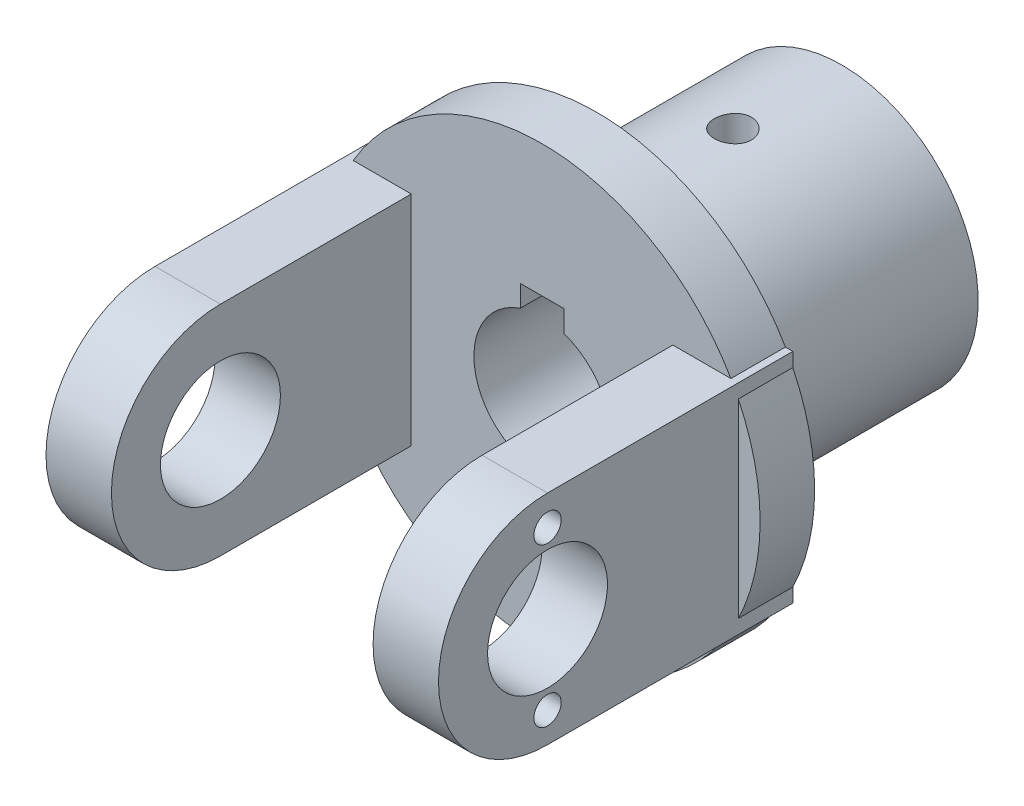
ISO-10303-21;
HEADER;
FILE_DESCRIPTION(('STEP AP214'),'2;1');
FILE_NAME('part.step','',(''),(''),'','','');
FILE_SCHEMA(('AUTOMOTIVE_DESIGN { 1 0 10303 214 1 1 1 1 }'));
ENDSEC;
DATA;
#1=APPLICATION_CONTEXT('core data for automotive mechanical design processes');
#2=APPLICATION_PROTOCOL_DEFINITION('international standard','automotive_design',2000,#1);
#3=PRODUCT_CONTEXT('',#1,'mechanical');
#4=PRODUCT('Part','Part','',(#3));
#5=PRODUCT_RELATED_PRODUCT_CATEGORY('part','',(#4));
#6=PRODUCT_DEFINITION_FORMATION('','',#4);
#7=PRODUCT_DEFINITION_CONTEXT('part definition',#1,'design');
#8=PRODUCT_DEFINITION('design','',#6,#7);
#9=PRODUCT_DEFINITION_SHAPE('','',#8);
#10=(LENGTH_UNIT() NAMED_UNIT(*) SI_UNIT(.MILLI.,.METRE.));
#11=(NAMED_UNIT(*) PLANE_ANGLE_UNIT() SI_UNIT($,.RADIAN.));
#12=(NAMED_UNIT(*) SI_UNIT($,.STERADIAN.) SOLID_ANGLE_UNIT());
#13=UNCERTAINTY_MEASURE_WITH_UNIT(LENGTH_MEASURE(1.E-05),#10,'distance_accuracy_value','');
#14=(GEOMETRIC_REPRESENTATION_CONTEXT(3) GLOBAL_UNCERTAINTY_ASSIGNED_CONTEXT((#13)) GLOBAL_UNIT_ASSIGNED_CONTEXT((#10,
#11,#12)) REPRESENTATION_CONTEXT('',''));
#15=CARTESIAN_POINT('',(0.,0.,0.));
#16=DIRECTION('',(0.,0.,1.));
#17=DIRECTION('',(1.,0.,0.));
#18=AXIS2_PLACEMENT_3D('',#15,#16,#17);
#19=CARTESIAN_POINT('',(40.,0.,55.));
#20=DIRECTION('',(0.,0.,-1.));
#21=DIRECTION('',(-1.,0.,0.));
#22=AXIS2_PLACEMENT_3D('',#19,#20,#21);
#23=PLANE('',#22);
#24=DIRECTION('',(0.,-1.,0.));
#25=VECTOR('',#24,1.);
#26=CARTESIAN_POINT('',(-24.,0.,55.));
#27=LINE('',#26,#25);
#28=CARTESIAN_POINT('',(-24.,20.,55.));
#29=VERTEX_POINT('',#28);
#30=CARTESIAN_POINT('',(-24.,-20.,55.));
#31=VERTEX_POINT('',#30);
#32=EDGE_CURVE('E288',#29,#31,#27,.T.);
#33=ORIENTED_EDGE('',*,*,#32,.T.);
#34=DIRECTION('',(-1.,0.,0.));
#35=VECTOR('',#34,1.);
#36=CARTESIAN_POINT('',(40.,-20.,55.));
#37=LINE('',#36,#35);
#38=CARTESIAN_POINT('',(-34.6410161513775,-20.,55.));
#39=VERTEX_POINT('',#38);
#40=EDGE_CURVE('E309',#31,#39,#37,.T.);
#41=ORIENTED_EDGE('',*,*,#40,.T.);
#42=CARTESIAN_POINT('',(0.,0.,55.));
#43=DIRECTION('',(0.,0.,-1.));
#44=DIRECTION('',(-1.,0.,0.));
#45=AXIS2_PLACEMENT_3D('',#42,#43,#44);
#46=CIRCLE('',#45,40.);
#47=CARTESIAN_POINT('',(34.6410161513775,-20.,55.));
#48=VERTEX_POINT('',#47);
#49=EDGE_CURVE('E370',#48,#39,#46,.T.);
#50=ORIENTED_EDGE('',*,*,#49,.F.);
#51=DIRECTION('',(1.,0.,0.));
#52=VECTOR('',#51,1.);
#53=CARTESIAN_POINT('',(40.,-20.,55.));
#54=LINE('',#53,#52);
#55=CARTESIAN_POINT('',(24.,-20.,55.));
#56=VERTEX_POINT('',#55);
#57=EDGE_CURVE('E395',#56,#48,#54,.T.);
#58=ORIENTED_EDGE('',*,*,#57,.F.);
#59=DIRECTION('',(0.,1.,0.));
#60=VECTOR('',#59,1.);
#61=CARTESIAN_POINT('',(24.,0.,55.));
#62=LINE('',#61,#60);
#63=CARTESIAN_POINT('',(24.,20.,55.));
#64=VERTEX_POINT('',#63);
#65=EDGE_CURVE('E391',#56,#64,#62,.T.);
#66=ORIENTED_EDGE('',*,*,#65,.T.);
#67=DIRECTION('',(-1.,0.,0.));
#68=VECTOR('',#67,1.);
#69=CARTESIAN_POINT('',(40.,20.,55.));
#70=LINE('',#69,#68);
#71=CARTESIAN_POINT('',(34.6410161513775,20.,55.));
#72=VERTEX_POINT('',#71);
#73=EDGE_CURVE('E398',#72,#64,#70,.T.);
#74=ORIENTED_EDGE('',*,*,#73,.F.);
#75=CARTESIAN_POINT('',(-34.6410161513775,20.,55.));
#76=VERTEX_POINT('',#75);
#77=EDGE_CURVE('E369',#76,#72,#46,.T.);
#78=ORIENTED_EDGE('',*,*,#77,.F.);
#79=DIRECTION('',(1.,0.,0.));
#80=VECTOR('',#79,1.);
#81=CARTESIAN_POINT('',(40.,20.,55.));
#82=LINE('',#81,#80);
#83=EDGE_CURVE('E301',#76,#29,#82,.T.);
#84=ORIENTED_EDGE('',*,*,#83,.T.);
#85=EDGE_LOOP('',(#33,#41,#50,#58,#66,#74,#78,#84));
#86=FACE_BOUND('',#85,.T.);
#87=DIRECTION('',(0.,-1.,0.));
#88=VECTOR('',#87,1.);
#89=CARTESIAN_POINT('',(-4.,0.,55.));
#90=LINE('',#89,#88);
#91=CARTESIAN_POINT('',(-4.,15.8,55.));
#92=VERTEX_POINT('',#91);
#93=CARTESIAN_POINT('',(-4.,11.842719282327,55.));
#94=VERTEX_POINT('',#93);
#95=EDGE_CURVE('E226',#92,#94,#90,.T.);
#96=ORIENTED_EDGE('',*,*,#95,.F.);
#97=DIRECTION('',(-1.,0.,0.));
#98=VECTOR('',#97,1.);
#99=CARTESIAN_POINT('',(40.,15.8,55.));
#100=LINE('',#99,#98);
#101=CARTESIAN_POINT('',(4.,15.8,55.));
#102=VERTEX_POINT('',#101);
#103=EDGE_CURVE('E228',#102,#92,#100,.T.);
#104=ORIENTED_EDGE('',*,*,#103,.F.);
#105=DIRECTION('',(0.,1.,0.));
#106=VECTOR('',#105,1.);
#107=CARTESIAN_POINT('',(4.,0.,55.));
#108=LINE('',#107,#106);
#109=CARTESIAN_POINT('',(4.,11.842719282327,55.));
#110=VERTEX_POINT('',#109);
#111=EDGE_CURVE('E194',#110,#102,#108,.T.);
#112=ORIENTED_EDGE('',*,*,#111,.F.);
#113=CARTESIAN_POINT('',(0.,0.,55.));
#114=DIRECTION('',(0.,0.,-1.));
#115=DIRECTION('',(-1.,0.,0.));
#116=AXIS2_PLACEMENT_3D('',#113,#114,#115);
#117=CIRCLE('',#116,12.5);
#118=EDGE_CURVE('E233',#94,#110,#117,.F.);
#119=ORIENTED_EDGE('',*,*,#118,.F.);
#120=EDGE_LOOP('',(#96,#104,#112,#119));
#121=FACE_BOUND('',#120,.T.);
#122=ADVANCED_FACE('F51',(#86,#121),#23,.F.);
#123=CARTESIAN_POINT('',(0.,0.,0.));
#124=DIRECTION('',(0.,0.,1.));
#125=DIRECTION('',(1.,0.,0.));
#126=AXIS2_PLACEMENT_3D('',#123,#124,#125);
#127=PLANE('',#126);
#128=CARTESIAN_POINT('',(0.,0.,0.));
#129=DIRECTION('',(0.,0.,-1.));
#130=DIRECTION('',(-1.,0.,0.));
#131=AXIS2_PLACEMENT_3D('',#128,#129,#130);
#132=CIRCLE('',#131,25.);
#133=CARTESIAN_POINT('',(-25.,0.,0.));
#134=VERTEX_POINT('',#133);
#135=EDGE_CURVE('E387',#134,#134,#132,.T.);
#136=ORIENTED_EDGE('',*,*,#135,.T.);
#137=EDGE_LOOP('',(#136));
#138=FACE_BOUND('',#137,.T.);
#139=DIRECTION('',(0.,-1.,0.));
#140=VECTOR('',#139,1.);
#141=CARTESIAN_POINT('',(-4.,15.8,0.));
#142=LINE('',#141,#140);
#143=CARTESIAN_POINT('',(-4.,15.8,0.));
#144=VERTEX_POINT('',#143);
#145=CARTESIAN_POINT('',(-4.,11.842719282327,0.));
#146=VERTEX_POINT('',#145);
#147=EDGE_CURVE('E213',#144,#146,#142,.T.);
#148=ORIENTED_EDGE('',*,*,#147,.T.);
#149=CARTESIAN_POINT('',(0.,0.,0.));
#150=DIRECTION('',(0.,0.,1.));
#151=DIRECTION('',(1.,0.,0.));
#152=AXIS2_PLACEMENT_3D('',#149,#150,#151);
#153=CIRCLE('',#152,12.5);
#154=CARTESIAN_POINT('',(4.,11.842719282327,0.));
#155=VERTEX_POINT('',#154);
#156=EDGE_CURVE('E211',#146,#155,#153,.T.);
#157=ORIENTED_EDGE('',*,*,#156,.T.);
#158=DIRECTION('',(0.,1.,0.));
#159=VECTOR('',#158,1.);
#160=CARTESIAN_POINT('',(4.,0.,0.));
#161=LINE('',#160,#159);
#162=CARTESIAN_POINT('',(4.,15.8,0.));
#163=VERTEX_POINT('',#162);
#164=EDGE_CURVE('E69',#155,#163,#161,.T.);
#165=ORIENTED_EDGE('',*,*,#164,.T.);
#166=DIRECTION('',(-1.,0.,0.));
#167=VECTOR('',#166,1.);
#168=CARTESIAN_POINT('',(4.,15.8,0.));
#169=LINE('',#168,#167);
#170=EDGE_CURVE('E201',#163,#144,#169,.T.);
#171=ORIENTED_EDGE('',*,*,#170,.T.);
#172=EDGE_LOOP('',(#148,#157,#165,#171));
#173=FACE_BOUND('',#172,.T.);
#174=ADVANCED_FACE('F54',(#138,#173),#127,.F.);
#175=CARTESIAN_POINT('',(0.,0.,110.));
#176=DIRECTION('',(0.,0.,-1.));
#177=DIRECTION('',(-1.,0.,0.));
#178=AXIS2_PLACEMENT_3D('',#175,#176,#177);
#179=CYLINDRICAL_SURFACE('',#178,12.5);
#180=ORIENTED_EDGE('',*,*,#156,.F.);
#181=DIRECTION('',(0.,0.,-1.));
#182=VECTOR('',#181,1.);
#183=CARTESIAN_POINT('',(-4.,11.842719282327,110.));
#184=LINE('',#183,#182);
#185=EDGE_CURVE('E11',#146,#94,#184,.F.);
#186=ORIENTED_EDGE('',*,*,#185,.T.);
#187=ORIENTED_EDGE('',*,*,#118,.T.);
#188=DIRECTION('',(0.,0.,-1.));
#189=VECTOR('',#188,1.);
#190=CARTESIAN_POINT('',(4.,11.842719282327,110.));
#191=LINE('',#190,#189);
#192=EDGE_CURVE('E62',#110,#155,#191,.T.);
#193=ORIENTED_EDGE('',*,*,#192,.T.);
#194=EDGE_LOOP('',(#180,#186,#187,#193));
#195=FACE_BOUND('',#194,.T.);
#196=ADVANCED_FACE('F410',(#195),#179,.F.);
#197=CARTESIAN_POINT('',(0.,0.,0.));
#198=DIRECTION('',(0.,0.,-1.));
#199=DIRECTION('',(-1.,0.,0.));
#200=AXIS2_PLACEMENT_3D('',#197,#198,#199);
#201=CYLINDRICAL_SURFACE('',#200,40.);
#202=DIRECTION('',(0.,0.,-1.));
#203=VECTOR('',#202,1.);
#204=CARTESIAN_POINT('',(-36.,-17.4355957741627,0.));
#205=LINE('',#204,#203);
#206=CARTESIAN_POINT('',(-36.,-17.4355957741627,55.));
#207=VERTEX_POINT('',#206);
#208=CARTESIAN_POINT('',(-36.,-17.4355957741627,45.));
#209=VERTEX_POINT('',#208);
#210=EDGE_CURVE('E298',#207,#209,#205,.T.);
#211=ORIENTED_EDGE('',*,*,#210,.F.);
#212=CARTESIAN_POINT('',(-36.,17.4355957741627,55.));
#213=VERTEX_POINT('',#212);
#214=EDGE_CURVE('E375',#207,#213,#46,.T.);
#215=ORIENTED_EDGE('',*,*,#214,.T.);
#216=DIRECTION('',(0.,0.,-1.));
#217=VECTOR('',#216,1.);
#218=CARTESIAN_POINT('',(-36.,17.4355957741627,0.));
#219=LINE('',#218,#217);
#220=CARTESIAN_POINT('',(-36.,17.4355957741627,45.));
#221=VERTEX_POINT('',#220);
#222=EDGE_CURVE('E295',#221,#213,#219,.F.);
#223=ORIENTED_EDGE('',*,*,#222,.F.);
#224=CARTESIAN_POINT('',(0.,0.,45.));
#225=DIRECTION('',(0.,0.,-1.));
#226=DIRECTION('',(-1.,0.,0.));
#227=AXIS2_PLACEMENT_3D('',#224,#225,#226);
#228=CIRCLE('',#227,40.);
#229=EDGE_CURVE('E381',#209,#221,#228,.T.);
#230=ORIENTED_EDGE('',*,*,#229,.F.);
#231=EDGE_LOOP('',(#211,#215,#223,#230));
#232=FACE_BOUND('',#231,.T.);
#233=ADVANCED_FACE('F589',(#232),#201,.T.);
#234=ORIENTED_EDGE('',*,*,#49,.T.);
#235=DIRECTION('',(0.,0.,-1.));
#236=VECTOR('',#235,1.);
#237=CARTESIAN_POINT('',(-34.6410161513775,-20.,0.));
#238=LINE('',#237,#236);
#239=CARTESIAN_POINT('',(-34.6410161513775,-20.,45.));
#240=VERTEX_POINT('',#239);
#241=EDGE_CURVE('E313',#39,#240,#238,.T.);
#242=ORIENTED_EDGE('',*,*,#241,.T.);
#243=CARTESIAN_POINT('',(34.6410161513775,-20.,45.));
#244=VERTEX_POINT('',#243);
#245=EDGE_CURVE('E376',#244,#240,#228,.T.);
#246=ORIENTED_EDGE('',*,*,#245,.F.);
#247=DIRECTION('',(0.,0.,-1.));
#248=VECTOR('',#247,1.);
#249=CARTESIAN_POINT('',(34.6410161513775,-20.,0.));
#250=LINE('',#249,#248);
#251=EDGE_CURVE('E362',#48,#244,#250,.T.);
#252=ORIENTED_EDGE('',*,*,#251,.F.);
#253=EDGE_LOOP('',(#234,#242,#246,#252));
#254=FACE_BOUND('',#253,.T.);
#255=ADVANCED_FACE('F441',(#254),#201,.T.);
#256=DIRECTION('',(0.,-1.,0.));
#257=VECTOR('',#256,1.);
#258=CARTESIAN_POINT('',(-36.,0.,55.));
#259=LINE('',#258,#257);
#260=EDGE_CURVE('E292',#213,#207,#259,.T.);
#261=ORIENTED_EDGE('',*,*,#260,.F.);
#262=ORIENTED_EDGE('',*,*,#214,.F.);
#263=EDGE_LOOP('',(#261,#262));
#264=FACE_BOUND('',#263,.T.);
#265=ADVANCED_FACE('F431',(#264),#23,.F.);
#266=CARTESIAN_POINT('',(-34.6410161513775,20.,45.));
#267=VERTEX_POINT('',#266);
#268=CARTESIAN_POINT('',(34.6410161513775,20.,45.));
#269=VERTEX_POINT('',#268);
#270=EDGE_CURVE('E382',#267,#269,#228,.T.);
#271=ORIENTED_EDGE('',*,*,#270,.F.);
#272=DIRECTION('',(0.,0.,-1.));
#273=VECTOR('',#272,1.);
#274=CARTESIAN_POINT('',(-34.6410161513775,20.,0.));
#275=LINE('',#274,#273);
#276=EDGE_CURVE('E305',#267,#76,#275,.F.);
#277=ORIENTED_EDGE('',*,*,#276,.T.);
#278=ORIENTED_EDGE('',*,*,#77,.T.);
#279=DIRECTION('',(0.,0.,-1.));
#280=VECTOR('',#279,1.);
#281=CARTESIAN_POINT('',(34.6410161513775,20.,0.));
#282=LINE('',#281,#280);
#283=EDGE_CURVE('E365',#269,#72,#282,.F.);
#284=ORIENTED_EDGE('',*,*,#283,.F.);
#285=EDGE_LOOP('',(#271,#277,#278,#284));
#286=FACE_BOUND('',#285,.T.);
#287=ADVANCED_FACE('F440',(#286),#201,.T.);
#288=DIRECTION('',(0.,0.,-1.));
#289=VECTOR('',#288,1.);
#290=CARTESIAN_POINT('',(36.,17.4355957741627,0.));
#291=LINE('',#290,#289);
#292=CARTESIAN_POINT('',(36.,17.4355957741627,55.));
#293=VERTEX_POINT('',#292);
#294=CARTESIAN_POINT('',(36.,17.4355957741627,45.));
#295=VERTEX_POINT('',#294);
#296=EDGE_CURVE('E359',#293,#295,#291,.T.);
#297=ORIENTED_EDGE('',*,*,#296,.F.);
#298=CARTESIAN_POINT('',(36.,-17.4355957741627,55.));
#299=VERTEX_POINT('',#298);
#300=EDGE_CURVE('E374',#293,#299,#46,.T.);
#301=ORIENTED_EDGE('',*,*,#300,.T.);
#302=DIRECTION('',(0.,0.,-1.));
#303=VECTOR('',#302,1.);
#304=CARTESIAN_POINT('',(36.,-17.4355957741627,0.));
#305=LINE('',#304,#303);
#306=CARTESIAN_POINT('',(36.,-17.4355957741627,45.));
#307=VERTEX_POINT('',#306);
#308=EDGE_CURVE('E356',#307,#299,#305,.F.);
#309=ORIENTED_EDGE('',*,*,#308,.F.);
#310=EDGE_CURVE('E380',#295,#307,#228,.T.);
#311=ORIENTED_EDGE('',*,*,#310,.F.);
#312=EDGE_LOOP('',(#297,#301,#309,#311));
#313=FACE_BOUND('',#312,.T.);
#314=ADVANCED_FACE('F445',(#313),#201,.T.);
#315=DIRECTION('',(0.,1.,0.));
#316=VECTOR('',#315,1.);
#317=CARTESIAN_POINT('',(36.,0.,55.));
#318=LINE('',#317,#316);
#319=EDGE_CURVE('E402',#299,#293,#318,.T.);
#320=ORIENTED_EDGE('',*,*,#319,.F.);
#321=ORIENTED_EDGE('',*,*,#300,.F.);
#322=EDGE_LOOP('',(#320,#321));
#323=FACE_BOUND('',#322,.T.);
#324=ADVANCED_FACE('F432',(#323),#23,.F.);
#325=CARTESIAN_POINT('',(0.,0.,0.));
#326=DIRECTION('',(0.,0.,-1.));
#327=DIRECTION('',(-1.,0.,0.));
#328=AXIS2_PLACEMENT_3D('',#325,#326,#327);
#329=CYLINDRICAL_SURFACE('',#328,25.);
#330=CARTESIAN_POINT('',(0.,25.,23.4));
#331=CARTESIAN_POINT('',(-0.190038738747455,24.9999971649874,23.3999920190031));
#332=CARTESIAN_POINT('',(-0.380192693621103,24.9978103049015,23.3840132827953));
#333=CARTESIAN_POINT('',(-0.755199336063914,24.9892968841899,23.3205288379817));
#334=CARTESIAN_POINT('',(-0.940046445510939,24.9829661229782,23.2729911380169));
#335=CARTESIAN_POINT('',(-1.29895690798675,24.9668773601371,23.147823764927));
#336=CARTESIAN_POINT('',(-1.47302779362116,24.9571217850202,23.0702153931264));
#337=CARTESIAN_POINT('',(-1.80564487523934,24.9352654651281,22.8871586532784));
#338=CARTESIAN_POINT('',(-1.9641935157258,24.923165090518,22.7817146785878));
#339=CARTESIAN_POINT('',(-2.2623219811294,24.8978803413549,22.545251430932));
#340=CARTESIAN_POINT('',(-2.40178681855678,24.8846901032271,22.4140877958851));
#341=CARTESIAN_POINT('',(-2.65679769293651,24.8587589406128,22.1302188333293));
#342=CARTESIAN_POINT('',(-2.77234244777072,24.8460180402411,21.9775123518596));
#343=CARTESIAN_POINT('',(-2.97667003204324,24.8223708605092,21.6541341159607));
#344=CARTESIAN_POINT('',(-3.06534359716716,24.8114721492211,21.4833927212925));
#345=CARTESIAN_POINT('',(-3.21271371652566,24.7928219835638,21.1292680615811));
#346=CARTESIAN_POINT('',(-3.27141161338015,24.7850703882375,20.9458853631638));
#347=CARTESIAN_POINT('',(-3.35681137808625,24.7736489233836,20.572884330683));
#348=CARTESIAN_POINT('',(-3.38370863030995,24.7699541387712,20.3833115069648));
#349=CARTESIAN_POINT('',(-3.40534847257354,24.7669886790679,20.0023096206952));
#350=CARTESIAN_POINT('',(-3.40009258587544,24.7677177943937,19.8108806465082));
#351=CARTESIAN_POINT('',(-3.35773542903181,24.773494955565,19.432969798851));
#352=CARTESIAN_POINT('',(-3.32085037277785,24.7785136773279,19.2464631792588));
#353=CARTESIAN_POINT('',(-3.21661972070118,24.7922588084146,18.8823113460876));
#354=CARTESIAN_POINT('',(-3.1492734047176,24.8009853053966,18.7046663421241));
#355=CARTESIAN_POINT('',(-2.98580270909591,24.8211956314162,18.3626145326358));
#356=CARTESIAN_POINT('',(-2.88958536816467,24.8326883433248,18.1982527007339));
#357=CARTESIAN_POINT('',(-2.67117025319588,24.8571294963758,17.8879260309975));
#358=CARTESIAN_POINT('',(-2.54897107413552,24.8700780162263,17.7419621887533));
#359=CARTESIAN_POINT('',(-2.28086757919013,24.8961018561724,17.4713206728419));
#360=CARTESIAN_POINT('',(-2.13477709186264,24.9091773453479,17.3468273669056));
#361=CARTESIAN_POINT('',(-1.82367623712506,24.9338828261207,17.124099723263));
#362=CARTESIAN_POINT('',(-1.6586658113027,24.9455128132549,17.0258654666304));
#363=CARTESIAN_POINT('',(-1.31425957460679,24.9660260793141,16.8584404064232));
#364=CARTESIAN_POINT('',(-1.1348575318788,24.9749081601679,16.7892622664575));
#365=CARTESIAN_POINT('',(-0.766835509205365,24.9889143876104,16.6820653127501));
#366=CARTESIAN_POINT('',(-0.578216041297734,24.9940387426923,16.644044770251));
#367=CARTESIAN_POINT('',(-0.198706287475513,24.9999248332664,16.6004838206208));
#368=CARTESIAN_POINT('',(-0.00784563713143578,25.0007206519387,16.5946896527024));
#369=CARTESIAN_POINT('',(0.372124176686201,24.9979523419091,16.6150746263747));
#370=CARTESIAN_POINT('',(0.561233384371014,24.9943883235654,16.6412529586624));
#371=CARTESIAN_POINT('',(0.931575112593776,24.9833219394978,16.7246289143942));
#372=CARTESIAN_POINT('',(1.1128356247433,24.9758350798434,16.7817044377525));
#373=CARTESIAN_POINT('',(1.46321334848584,24.9577605417121,16.9251269098261));
#374=CARTESIAN_POINT('',(1.63233007972572,24.94717274066,17.0114750156604));
#375=CARTESIAN_POINT('',(1.95474568054827,24.9239901580845,17.2115977038623));
#376=CARTESIAN_POINT('',(2.10794262561995,24.911383618046,17.3255351095405));
#377=CARTESIAN_POINT('',(2.39313031055053,24.8856076810675,17.577373325304));
#378=CARTESIAN_POINT('',(2.52512004647339,24.8724382575183,17.7152752692126));
#379=CARTESIAN_POINT('',(2.76505661814802,24.8469144341322,18.0122509183034));
#380=CARTESIAN_POINT('',(2.87283443266647,24.8345661633416,18.1714617863144));
#381=CARTESIAN_POINT('',(3.06011709037647,24.8121868650613,18.5058756931536));
#382=CARTESIAN_POINT('',(3.1396225858955,24.802155784109,18.6810783628856));
#383=CARTESIAN_POINT('',(3.26783494596426,24.7855895552162,19.0419744866536));
#384=CARTESIAN_POINT('',(3.31663444293983,24.7790439018767,19.2276345288972));
#385=CARTESIAN_POINT('',(3.38234651255799,24.7701604735335,19.6046094356322));
#386=CARTESIAN_POINT('',(3.39926086549828,24.7678224635976,19.7959239838001));
#387=CARTESIAN_POINT('',(3.400685783794,24.767626718018,20.1770944499836));
#388=CARTESIAN_POINT('',(3.38546195998573,24.7697322579393,20.3669494103771));
#389=CARTESIAN_POINT('',(3.32360794809512,24.7781070595575,20.7413740841372));
#390=CARTESIAN_POINT('',(3.2769777771785,24.7843763189787,20.9259438003925));
#391=CARTESIAN_POINT('',(3.15372242190107,24.8003601931785,21.2845075010051));
#392=CARTESIAN_POINT('',(3.07711247014543,24.8100730580399,21.4585068043612));
#393=CARTESIAN_POINT('',(2.89609834945446,24.8318522929639,21.791224339097));
#394=CARTESIAN_POINT('',(2.79169358154905,24.8439187137435,21.9499422410667));
#395=CARTESIAN_POINT('',(2.55707625357565,24.8691646899212,22.2489461235849));
#396=CARTESIAN_POINT('',(2.42666616663949,24.882352292173,22.3890764466249));
#397=CARTESIAN_POINT('',(2.14415565503817,24.908285260031,22.645562356161));
#398=CARTESIAN_POINT('',(1.99205015718582,24.9210305213325,22.7619123664174));
#399=CARTESIAN_POINT('',(1.66967201220552,24.9447071257783,22.9679909130431));
#400=CARTESIAN_POINT('',(1.49932076289528,24.9556300562187,23.0575974117423));
#401=CARTESIAN_POINT('',(1.14592775248295,24.9743475181181,23.206798841381));
#402=CARTESIAN_POINT('',(0.962899750224844,24.9821453808814,23.2664257477561));
#403=CARTESIAN_POINT('',(0.649146235640572,24.9918957594898,23.3400121784971));
#404=CARTESIAN_POINT('',(0.520382830563562,24.9949197116433,23.362474436803));
#405=CARTESIAN_POINT('',(0.261097737594998,24.9989727965641,23.3924710197939));
#406=CARTESIAN_POINT('',(0.130576066120282,25.0000019479438,23.4000054837618));
#407=CARTESIAN_POINT('',(0.,25.,23.4));
#408=B_SPLINE_CURVE_WITH_KNOTS('',3,(#330,#331,#332,#333,#334,#335,#336,#337,#338,#339,#340,
#341,#342,#343,#344,#345,#346,#347,#348,#349,#350,#351,#352,#353,#354,#355,#356,#357,#358,#359,
#360,#361,#362,#363,#364,#365,#366,#367,#368,#369,#370,#371,#372,#373,#374,#375,#376,#377,#378,
#379,#380,#381,#382,#383,#384,#385,#386,#387,#388,#389,#390,#391,#392,#393,#394,#395,#396,#397,
#398,#399,#400,#401,#402,#403,#404,#405,#406,#407),.UNSPECIFIED.,.T.,.F.,(4,2,2,2,2,2,2,2,2,2,2,
2,2,2,2,2,2,2,2,2,2,2,2,2,2,2,2,2,2,2,2,2,2,2,2,2,2,2,4),(0.,0.569639187230749,1.13985670191166,
1.7096710248249,2.27939546635499,2.85241430863755,3.42546385682343,4.00081321749145,
4.5761368058146,5.14790690479406,5.71964991624947,6.28751542475276,6.8553943593553,
7.42512178461202,7.99488002692261,8.56931044417373,9.14374263493458,9.71842492295734,
10.2930753229746,10.8631942660817,11.4332987783704,12.0011666150259,12.5690569016086,
13.1403840800345,13.711738296769,14.2869650346729,14.8621784995032,15.4356482610485,
16.0090860021288,16.5778030417894,17.1465197706072,17.7149479111617,18.2833883021664,
18.8563231656666,19.429392222777,20.0050377077015,20.5800679150823,20.9714719976723,
21.3628724282729),.UNSPECIFIED.);
#409=CARTESIAN_POINT('',(0.,25.,23.4));
#410=VERTEX_POINT('',#409);
#411=EDGE_CURVE('E218',#410,#410,#408,.T.);
#412=ORIENTED_EDGE('',*,*,#411,.T.);
#413=EDGE_LOOP('',(#412));
#414=FACE_BOUND('',#413,.T.);
#415=ORIENTED_EDGE('',*,*,#135,.F.);
#416=EDGE_LOOP('',(#415));
#417=FACE_BOUND('',#416,.T.);
#418=CARTESIAN_POINT('',(0.,0.,45.));
#419=DIRECTION('',(0.,0.,-1.));
#420=DIRECTION('',(-1.,0.,0.));
#421=AXIS2_PLACEMENT_3D('',#418,#419,#420);
#422=CIRCLE('',#421,25.);
#423=CARTESIAN_POINT('',(-25.,0.,45.));
#424=VERTEX_POINT('',#423);
#425=EDGE_CURVE('E383',#424,#424,#422,.T.);
#426=ORIENTED_EDGE('',*,*,#425,.T.);
#427=EDGE_LOOP('',(#426));
#428=FACE_BOUND('',#427,.T.);
#429=ADVANCED_FACE('F444',(#414,#417,#428),#329,.T.);
#430=CARTESIAN_POINT('',(25.,0.,45.));
#431=DIRECTION('',(0.,0.,1.));
#432=DIRECTION('',(1.,0.,0.));
#433=AXIS2_PLACEMENT_3D('',#430,#431,#432);
#434=PLANE('',#433);
#435=ORIENTED_EDGE('',*,*,#229,.T.);
#436=DIRECTION('',(0.,1.,0.));
#437=VECTOR('',#436,1.);
#438=CARTESIAN_POINT('',(-36.,20.,45.));
#439=LINE('',#438,#437);
#440=CARTESIAN_POINT('',(-36.,20.,45.));
#441=VERTEX_POINT('',#440);
#442=EDGE_CURVE('E255',#221,#441,#439,.T.);
#443=ORIENTED_EDGE('',*,*,#442,.T.);
#444=DIRECTION('',(1.,0.,0.));
#445=VECTOR('',#444,1.);
#446=CARTESIAN_POINT('',(-36.,20.,45.));
#447=LINE('',#446,#445);
#448=EDGE_CURVE('E266',#441,#267,#447,.T.);
#449=ORIENTED_EDGE('',*,*,#448,.T.);
#450=ORIENTED_EDGE('',*,*,#270,.T.);
#451=DIRECTION('',(-1.,0.,0.));
#452=VECTOR('',#451,1.);
#453=CARTESIAN_POINT('',(36.,20.,45.));
#454=LINE('',#453,#452);
#455=CARTESIAN_POINT('',(36.,20.,45.));
#456=VERTEX_POINT('',#455);
#457=EDGE_CURVE('E352',#456,#269,#454,.T.);
#458=ORIENTED_EDGE('',*,*,#457,.F.);
#459=DIRECTION('',(0.,1.,0.));
#460=VECTOR('',#459,1.);
#461=CARTESIAN_POINT('',(36.,20.,45.));
#462=LINE('',#461,#460);
#463=EDGE_CURVE('E322',#295,#456,#462,.T.);
#464=ORIENTED_EDGE('',*,*,#463,.F.);
#465=ORIENTED_EDGE('',*,*,#310,.T.);
#466=CARTESIAN_POINT('',(36.,-20.,45.));
#467=VERTEX_POINT('',#466);
#468=EDGE_CURVE('E318',#467,#307,#462,.T.);
#469=ORIENTED_EDGE('',*,*,#468,.F.);
#470=DIRECTION('',(-1.,0.,0.));
#471=VECTOR('',#470,1.);
#472=CARTESIAN_POINT('',(36.,-20.,45.));
#473=LINE('',#472,#471);
#474=EDGE_CURVE('E331',#467,#244,#473,.T.);
#475=ORIENTED_EDGE('',*,*,#474,.T.);
#476=ORIENTED_EDGE('',*,*,#245,.T.);
#477=DIRECTION('',(1.,0.,0.));
#478=VECTOR('',#477,1.);
#479=CARTESIAN_POINT('',(-36.,-20.,45.));
#480=LINE('',#479,#478);
#481=CARTESIAN_POINT('',(-36.,-20.,45.));
#482=VERTEX_POINT('',#481);
#483=EDGE_CURVE('E285',#482,#240,#480,.T.);
#484=ORIENTED_EDGE('',*,*,#483,.F.);
#485=EDGE_CURVE('E250',#482,#209,#439,.T.);
#486=ORIENTED_EDGE('',*,*,#485,.T.);
#487=EDGE_LOOP('',(#435,#443,#449,#450,#458,#464,#465,#469,#475,#476,#484,#486));
#488=FACE_BOUND('',#487,.T.);
#489=ORIENTED_EDGE('',*,*,#425,.F.);
#490=EDGE_LOOP('',(#489));
#491=FACE_BOUND('',#490,.T.);
#492=ADVANCED_FACE('F450',(#488,#491),#434,.F.);
#493=CARTESIAN_POINT('',(36.,20.,90.));
#494=DIRECTION('',(0.,-1.,0.));
#495=DIRECTION('',(0.,0.,-1.));
#496=AXIS2_PLACEMENT_3D('',#493,#494,#495);
#497=PLANE('',#496);
#498=ORIENTED_EDGE('',*,*,#457,.T.);
#499=ORIENTED_EDGE('',*,*,#283,.T.);
#500=ORIENTED_EDGE('',*,*,#73,.T.);
#501=DIRECTION('',(0.,0.,1.));
#502=VECTOR('',#501,1.);
#503=CARTESIAN_POINT('',(24.,20.,90.));
#504=LINE('',#503,#502);
#505=CARTESIAN_POINT('',(24.,20.,90.));
#506=VERTEX_POINT('',#505);
#507=EDGE_CURVE('E317',#64,#506,#504,.T.);
#508=ORIENTED_EDGE('',*,*,#507,.T.);
#509=DIRECTION('',(-1.,0.,0.));
#510=VECTOR('',#509,1.);
#511=CARTESIAN_POINT('',(36.,20.,90.));
#512=LINE('',#511,#510);
#513=CARTESIAN_POINT('',(36.,20.,90.));
#514=VERTEX_POINT('',#513);
#515=EDGE_CURVE('E348',#514,#506,#512,.T.);
#516=ORIENTED_EDGE('',*,*,#515,.F.);
#517=DIRECTION('',(0.,0.,1.));
#518=VECTOR('',#517,1.);
#519=CARTESIAN_POINT('',(36.,20.,90.));
#520=LINE('',#519,#518);
#521=EDGE_CURVE('E321',#456,#514,#520,.T.);
#522=ORIENTED_EDGE('',*,*,#521,.F.);
#523=EDGE_LOOP('',(#498,#499,#500,#508,#516,#522));
#524=FACE_BOUND('',#523,.T.);
#525=ADVANCED_FACE('F478',(#524),#497,.F.);
#526=CARTESIAN_POINT('',(36.,-20.,45.));
#527=DIRECTION('',(0.,1.,0.));
#528=DIRECTION('',(0.,0.,1.));
#529=AXIS2_PLACEMENT_3D('',#526,#527,#528);
#530=PLANE('',#529);
#531=ORIENTED_EDGE('',*,*,#57,.T.);
#532=ORIENTED_EDGE('',*,*,#251,.T.);
#533=ORIENTED_EDGE('',*,*,#474,.F.);
#534=DIRECTION('',(0.,0.,-1.));
#535=VECTOR('',#534,1.);
#536=CARTESIAN_POINT('',(36.,-20.,45.));
#537=LINE('',#536,#535);
#538=CARTESIAN_POINT('',(36.,-20.,90.));
#539=VERTEX_POINT('',#538);
#540=EDGE_CURVE('E328',#539,#467,#537,.T.);
#541=ORIENTED_EDGE('',*,*,#540,.F.);
#542=DIRECTION('',(-1.,0.,0.));
#543=VECTOR('',#542,1.);
#544=CARTESIAN_POINT('',(36.,-20.,90.));
#545=LINE('',#544,#543);
#546=CARTESIAN_POINT('',(24.,-20.,90.));
#547=VERTEX_POINT('',#546);
#548=EDGE_CURVE('E344',#539,#547,#545,.T.);
#549=ORIENTED_EDGE('',*,*,#548,.T.);
#550=DIRECTION('',(0.,0.,-1.));
#551=VECTOR('',#550,1.);
#552=CARTESIAN_POINT('',(24.,-20.,45.));
#553=LINE('',#552,#551);
#554=EDGE_CURVE('E337',#547,#56,#553,.T.);
#555=ORIENTED_EDGE('',*,*,#554,.T.);
#556=EDGE_LOOP('',(#531,#532,#533,#541,#549,#555));
#557=FACE_BOUND('',#556,.T.);
#558=ADVANCED_FACE('F488',(#557),#530,.F.);
#559=CARTESIAN_POINT('',(36.,0.,90.));
#560=DIRECTION('',(-1.,0.,0.));
#561=DIRECTION('',(0.,0.,1.));
#562=AXIS2_PLACEMENT_3D('',#559,#560,#561);
#563=PLANE('',#562);
#564=CARTESIAN_POINT('',(36.,14.5,90.));
#565=DIRECTION('',(1.,0.,0.));
#566=DIRECTION('',(0.,0.,-1.));
#567=AXIS2_PLACEMENT_3D('',#564,#565,#566);
#568=CIRCLE('',#567,2.5);
#569=CARTESIAN_POINT('',(36.,14.5,87.5));
#570=VERTEX_POINT('',#569);
#571=EDGE_CURVE('E934',#570,#570,#568,.T.);
#572=ORIENTED_EDGE('',*,*,#571,.F.);
#573=EDGE_LOOP('',(#572));
#574=FACE_BOUND('',#573,.T.);
#575=CARTESIAN_POINT('',(36.,-14.5,90.));
#576=DIRECTION('',(1.,0.,0.));
#577=DIRECTION('',(0.,0.,-1.));
#578=AXIS2_PLACEMENT_3D('',#575,#576,#577);
#579=CIRCLE('',#578,2.5);
#580=CARTESIAN_POINT('',(36.,-14.5,87.5));
#581=VERTEX_POINT('',#580);
#582=EDGE_CURVE('E918',#581,#581,#579,.T.);
#583=ORIENTED_EDGE('',*,*,#582,.F.);
#584=EDGE_LOOP('',(#583));
#585=FACE_BOUND('',#584,.T.);
#586=CARTESIAN_POINT('',(36.,0.,90.));
#587=DIRECTION('',(-1.,0.,0.));
#588=DIRECTION('',(0.,0.,1.));
#589=AXIS2_PLACEMENT_3D('',#586,#587,#588);
#590=CIRCLE('',#589,11.);
#591=CARTESIAN_POINT('',(36.,0.,101.));
#592=VERTEX_POINT('',#591);
#593=EDGE_CURVE('E246',#592,#592,#590,.T.);
#594=ORIENTED_EDGE('',*,*,#593,.T.);
#595=EDGE_LOOP('',(#594));
#596=FACE_BOUND('',#595,.T.);
#597=ORIENTED_EDGE('',*,*,#319,.T.);
#598=ORIENTED_EDGE('',*,*,#296,.T.);
#599=ORIENTED_EDGE('',*,*,#463,.T.);
#600=ORIENTED_EDGE('',*,*,#521,.T.);
#601=CARTESIAN_POINT('',(36.,0.,90.));
#602=DIRECTION('',(1.,0.,0.));
#603=DIRECTION('',(0.,0.,1.));
#604=AXIS2_PLACEMENT_3D('',#601,#602,#603);
#605=CIRCLE('',#604,20.);
#606=EDGE_CURVE('E325',#514,#539,#605,.T.);
#607=ORIENTED_EDGE('',*,*,#606,.T.);
#608=ORIENTED_EDGE('',*,*,#540,.T.);
#609=ORIENTED_EDGE('',*,*,#468,.T.);
#610=ORIENTED_EDGE('',*,*,#308,.T.);
#611=EDGE_LOOP('',(#597,#598,#599,#600,#607,#608,#609,#610));
#612=FACE_BOUND('',#611,.T.);
#613=ADVANCED_FACE('F542',(#574,#585,#596,#612),#563,.F.);
#614=CARTESIAN_POINT('',(24.,0.,90.));
#615=DIRECTION('',(-1.,0.,0.));
#616=DIRECTION('',(0.,0.,1.));
#617=AXIS2_PLACEMENT_3D('',#614,#615,#616);
#618=PLANE('',#617);
#619=CARTESIAN_POINT('',(24.,0.,90.));
#620=DIRECTION('',(-1.,0.,0.));
#621=DIRECTION('',(0.,0.,1.));
#622=AXIS2_PLACEMENT_3D('',#619,#620,#621);
#623=CIRCLE('',#622,11.);
#624=CARTESIAN_POINT('',(24.,0.,101.));
#625=VERTEX_POINT('',#624);
#626=EDGE_CURVE('E242',#625,#625,#623,.T.);
#627=ORIENTED_EDGE('',*,*,#626,.F.);
#628=EDGE_LOOP('',(#627));
#629=FACE_BOUND('',#628,.T.);
#630=ORIENTED_EDGE('',*,*,#65,.F.);
#631=ORIENTED_EDGE('',*,*,#554,.F.);
#632=CARTESIAN_POINT('',(24.,0.,90.));
#633=DIRECTION('',(1.,0.,0.));
#634=DIRECTION('',(0.,0.,1.));
#635=AXIS2_PLACEMENT_3D('',#632,#633,#634);
#636=CIRCLE('',#635,20.);
#637=EDGE_CURVE('E334',#506,#547,#636,.T.);
#638=ORIENTED_EDGE('',*,*,#637,.F.);
#639=ORIENTED_EDGE('',*,*,#507,.F.);
#640=EDGE_LOOP('',(#630,#631,#638,#639));
#641=FACE_BOUND('',#640,.T.);
#642=ADVANCED_FACE('F485',(#629,#641),#618,.T.);
#643=CARTESIAN_POINT('',(36.,0.,90.));
#644=DIRECTION('',(-1.,0.,0.));
#645=DIRECTION('',(0.,0.,1.));
#646=AXIS2_PLACEMENT_3D('',#643,#644,#645);
#647=CYLINDRICAL_SURFACE('',#646,20.);
#648=ORIENTED_EDGE('',*,*,#637,.T.);
#649=ORIENTED_EDGE('',*,*,#548,.F.);
#650=ORIENTED_EDGE('',*,*,#606,.F.);
#651=ORIENTED_EDGE('',*,*,#515,.T.);
#652=EDGE_LOOP('',(#648,#649,#650,#651));
#653=FACE_BOUND('',#652,.T.);
#654=ADVANCED_FACE('F495',(#653),#647,.T.);
#655=CARTESIAN_POINT('',(-36.,-20.,45.));
#656=DIRECTION('',(0.,-1.,0.));
#657=DIRECTION('',(0.,0.,-1.));
#658=AXIS2_PLACEMENT_3D('',#655,#656,#657);
#659=PLANE('',#658);
#660=ORIENTED_EDGE('',*,*,#241,.F.);
#661=ORIENTED_EDGE('',*,*,#40,.F.);
#662=DIRECTION('',(0.,0.,-1.));
#663=VECTOR('',#662,1.);
#664=CARTESIAN_POINT('',(-24.,-20.,45.));
#665=LINE('',#664,#663);
#666=CARTESIAN_POINT('',(-24.,-20.,90.));
#667=VERTEX_POINT('',#666);
#668=EDGE_CURVE('E77',#667,#31,#665,.T.);
#669=ORIENTED_EDGE('',*,*,#668,.F.);
#670=DIRECTION('',(1.,0.,0.));
#671=VECTOR('',#670,1.);
#672=CARTESIAN_POINT('',(-36.,-20.,90.));
#673=LINE('',#672,#671);
#674=CARTESIAN_POINT('',(-36.,-20.,90.));
#675=VERTEX_POINT('',#674);
#676=EDGE_CURVE('E282',#675,#667,#673,.T.);
#677=ORIENTED_EDGE('',*,*,#676,.F.);
#678=DIRECTION('',(0.,0.,-1.));
#679=VECTOR('',#678,1.);
#680=CARTESIAN_POINT('',(-36.,-20.,45.));
#681=LINE('',#680,#679);
#682=EDGE_CURVE('E254',#675,#482,#681,.T.);
#683=ORIENTED_EDGE('',*,*,#682,.T.);
#684=ORIENTED_EDGE('',*,*,#483,.T.);
#685=EDGE_LOOP('',(#660,#661,#669,#677,#683,#684));
#686=FACE_BOUND('',#685,.T.);
#687=ADVANCED_FACE('F534',(#686),#659,.T.);
#688=CARTESIAN_POINT('',(-36.,20.,90.));
#689=DIRECTION('',(0.,1.,0.));
#690=DIRECTION('',(0.,0.,1.));
#691=AXIS2_PLACEMENT_3D('',#688,#689,#690);
#692=PLANE('',#691);
#693=ORIENTED_EDGE('',*,*,#276,.F.);
#694=ORIENTED_EDGE('',*,*,#448,.F.);
#695=DIRECTION('',(0.,0.,1.));
#696=VECTOR('',#695,1.);
#697=CARTESIAN_POINT('',(-36.,20.,90.));
#698=LINE('',#697,#696);
#699=CARTESIAN_POINT('',(-36.,20.,90.));
#700=VERTEX_POINT('',#699);
#701=EDGE_CURVE('E262',#441,#700,#698,.T.);
#702=ORIENTED_EDGE('',*,*,#701,.T.);
#703=DIRECTION('',(1.,0.,0.));
#704=VECTOR('',#703,1.);
#705=CARTESIAN_POINT('',(-36.,20.,90.));
#706=LINE('',#705,#704);
#707=CARTESIAN_POINT('',(-24.,20.,90.));
#708=VERTEX_POINT('',#707);
#709=EDGE_CURVE('E278',#700,#708,#706,.T.);
#710=ORIENTED_EDGE('',*,*,#709,.T.);
#711=DIRECTION('',(0.,0.,1.));
#712=VECTOR('',#711,1.);
#713=CARTESIAN_POINT('',(-24.,20.,90.));
#714=LINE('',#713,#712);
#715=EDGE_CURVE('E272',#29,#708,#714,.T.);
#716=ORIENTED_EDGE('',*,*,#715,.F.);
#717=ORIENTED_EDGE('',*,*,#83,.F.);
#718=EDGE_LOOP('',(#693,#694,#702,#710,#716,#717));
#719=FACE_BOUND('',#718,.T.);
#720=ADVANCED_FACE('F504',(#719),#692,.T.);
#721=CARTESIAN_POINT('',(-36.,0.,90.));
#722=DIRECTION('',(1.,0.,0.));
#723=DIRECTION('',(0.,0.,1.));
#724=AXIS2_PLACEMENT_3D('',#721,#722,#723);
#725=PLANE('',#724);
#726=CARTESIAN_POINT('',(-36.,14.5,90.));
#727=DIRECTION('',(1.,0.,0.));
#728=DIRECTION('',(0.,0.,-1.));
#729=AXIS2_PLACEMENT_3D('',#726,#727,#728);
#730=CIRCLE('',#729,2.5);
#731=CARTESIAN_POINT('',(-36.,14.5,87.5));
#732=VERTEX_POINT('',#731);
#733=EDGE_CURVE('E914',#732,#732,#730,.T.);
#734=ORIENTED_EDGE('',*,*,#733,.T.);
#735=EDGE_LOOP('',(#734));
#736=FACE_BOUND('',#735,.T.);
#737=CARTESIAN_POINT('',(-36.,-14.5,90.));
#738=DIRECTION('',(1.,0.,0.));
#739=DIRECTION('',(0.,0.,-1.));
#740=AXIS2_PLACEMENT_3D('',#737,#738,#739);
#741=CIRCLE('',#740,2.5);
#742=CARTESIAN_POINT('',(-36.,-14.5,87.5));
#743=VERTEX_POINT('',#742);
#744=EDGE_CURVE('E927',#743,#743,#741,.T.);
#745=ORIENTED_EDGE('',*,*,#744,.T.);
#746=EDGE_LOOP('',(#745));
#747=FACE_BOUND('',#746,.T.);
#748=CARTESIAN_POINT('',(-36.,0.,90.));
#749=DIRECTION('',(1.,0.,0.));
#750=DIRECTION('',(0.,0.,-1.));
#751=AXIS2_PLACEMENT_3D('',#748,#749,#750);
#752=CIRCLE('',#751,11.);
#753=CARTESIAN_POINT('',(-36.,0.,79.));
#754=VERTEX_POINT('',#753);
#755=EDGE_CURVE('E238',#754,#754,#752,.T.);
#756=ORIENTED_EDGE('',*,*,#755,.T.);
#757=EDGE_LOOP('',(#756));
#758=FACE_BOUND('',#757,.T.);
#759=ORIENTED_EDGE('',*,*,#260,.T.);
#760=ORIENTED_EDGE('',*,*,#210,.T.);
#761=ORIENTED_EDGE('',*,*,#485,.F.);
#762=ORIENTED_EDGE('',*,*,#682,.F.);
#763=CARTESIAN_POINT('',(-36.,0.,90.));
#764=DIRECTION('',(1.,0.,0.));
#765=DIRECTION('',(0.,0.,1.));
#766=AXIS2_PLACEMENT_3D('',#763,#764,#765);
#767=CIRCLE('',#766,20.);
#768=EDGE_CURVE('E258',#700,#675,#767,.T.);
#769=ORIENTED_EDGE('',*,*,#768,.F.);
#770=ORIENTED_EDGE('',*,*,#701,.F.);
#771=ORIENTED_EDGE('',*,*,#442,.F.);
#772=ORIENTED_EDGE('',*,*,#222,.T.);
#773=EDGE_LOOP('',(#759,#760,#761,#762,#769,#770,#771,#772));
#774=FACE_BOUND('',#773,.T.);
#775=ADVANCED_FACE('F507',(#736,#747,#758,#774),#725,.F.);
#776=CARTESIAN_POINT('',(-24.,0.,90.));
#777=DIRECTION('',(1.,0.,0.));
#778=DIRECTION('',(0.,0.,1.));
#779=AXIS2_PLACEMENT_3D('',#776,#777,#778);
#780=PLANE('',#779);
#781=CARTESIAN_POINT('',(-24.,0.,90.));
#782=DIRECTION('',(1.,0.,0.));
#783=DIRECTION('',(0.,0.,-1.));
#784=AXIS2_PLACEMENT_3D('',#781,#782,#783);
#785=CIRCLE('',#784,11.);
#786=CARTESIAN_POINT('',(-24.,0.,79.));
#787=VERTEX_POINT('',#786);
#788=EDGE_CURVE('E237',#787,#787,#785,.T.);
#789=ORIENTED_EDGE('',*,*,#788,.F.);
#790=EDGE_LOOP('',(#789));
#791=FACE_BOUND('',#790,.T.);
#792=ORIENTED_EDGE('',*,*,#32,.F.);
#793=ORIENTED_EDGE('',*,*,#715,.T.);
#794=CARTESIAN_POINT('',(-24.,0.,90.));
#795=DIRECTION('',(1.,0.,0.));
#796=DIRECTION('',(0.,0.,1.));
#797=AXIS2_PLACEMENT_3D('',#794,#795,#796);
#798=CIRCLE('',#797,20.);
#799=EDGE_CURVE('E269',#708,#667,#798,.T.);
#800=ORIENTED_EDGE('',*,*,#799,.T.);
#801=ORIENTED_EDGE('',*,*,#668,.T.);
#802=EDGE_LOOP('',(#792,#793,#800,#801));
#803=FACE_BOUND('',#802,.T.);
#804=ADVANCED_FACE('F514',(#791,#803),#780,.T.);
#805=CARTESIAN_POINT('',(-36.,0.,90.));
#806=DIRECTION('',(1.,0.,0.));
#807=DIRECTION('',(0.,0.,-1.));
#808=AXIS2_PLACEMENT_3D('',#805,#806,#807);
#809=CYLINDRICAL_SURFACE('',#808,20.);
#810=ORIENTED_EDGE('',*,*,#799,.F.);
#811=ORIENTED_EDGE('',*,*,#709,.F.);
#812=ORIENTED_EDGE('',*,*,#768,.T.);
#813=ORIENTED_EDGE('',*,*,#676,.T.);
#814=EDGE_LOOP('',(#810,#811,#812,#813));
#815=FACE_BOUND('',#814,.T.);
#816=ADVANCED_FACE('F512',(#815),#809,.T.);
#817=CARTESIAN_POINT('',(-111.,0.,90.));
#818=DIRECTION('',(1.,0.,0.));
#819=DIRECTION('',(0.,0.,-1.));
#820=AXIS2_PLACEMENT_3D('',#817,#818,#819);
#821=CYLINDRICAL_SURFACE('',#820,11.);
#822=ORIENTED_EDGE('',*,*,#788,.T.);
#823=EDGE_LOOP('',(#822));
#824=FACE_BOUND('',#823,.T.);
#825=ORIENTED_EDGE('',*,*,#755,.F.);
#826=EDGE_LOOP('',(#825));
#827=FACE_BOUND('',#826,.T.);
#828=ADVANCED_FACE('F521',(#824,#827),#821,.F.);
#829=ORIENTED_EDGE('',*,*,#626,.T.);
#830=EDGE_LOOP('',(#829));
#831=FACE_BOUND('',#830,.T.);
#832=ORIENTED_EDGE('',*,*,#593,.F.);
#833=EDGE_LOOP('',(#832));
#834=FACE_BOUND('',#833,.T.);
#835=ADVANCED_FACE('F423',(#831,#834),#821,.F.);
#836=CARTESIAN_POINT('',(4.,15.8,110.));
#837=DIRECTION('',(0.,-1.,0.));
#838=DIRECTION('',(0.,0.,-1.));
#839=AXIS2_PLACEMENT_3D('',#836,#837,#838);
#840=PLANE('',#839);
#841=CARTESIAN_POINT('',(0.,15.8,20.));
#842=DIRECTION('',(0.,-1.,0.));
#843=DIRECTION('',(0.,0.,-1.));
#844=AXIS2_PLACEMENT_3D('',#841,#842,#843);
#845=CIRCLE('',#844,3.4);
#846=CARTESIAN_POINT('',(0.,15.8,16.6));
#847=VERTEX_POINT('',#846);
#848=EDGE_CURVE('E56',#847,#847,#845,.T.);
#849=ORIENTED_EDGE('',*,*,#848,.F.);
#850=EDGE_LOOP('',(#849));
#851=FACE_BOUND('',#850,.T.);
#852=ORIENTED_EDGE('',*,*,#103,.T.);
#853=DIRECTION('',(0.,0.,-1.));
#854=VECTOR('',#853,1.);
#855=CARTESIAN_POINT('',(-4.,15.8,110.));
#856=LINE('',#855,#854);
#857=EDGE_CURVE('E198',#92,#144,#856,.T.);
#858=ORIENTED_EDGE('',*,*,#857,.T.);
#859=ORIENTED_EDGE('',*,*,#170,.F.);
#860=DIRECTION('',(0.,0.,-1.));
#861=VECTOR('',#860,1.);
#862=CARTESIAN_POINT('',(4.,15.8,110.));
#863=LINE('',#862,#861);
#864=EDGE_CURVE('E190',#102,#163,#863,.T.);
#865=ORIENTED_EDGE('',*,*,#864,.F.);
#866=EDGE_LOOP('',(#852,#858,#859,#865));
#867=FACE_BOUND('',#866,.T.);
#868=ADVANCED_FACE('F202',(#851,#867),#840,.T.);
#869=CARTESIAN_POINT('',(-4.,15.8,110.));
#870=DIRECTION('',(1.,0.,0.));
#871=DIRECTION('',(0.,0.,-1.));
#872=AXIS2_PLACEMENT_3D('',#869,#870,#871);
#873=PLANE('',#872);
#874=ORIENTED_EDGE('',*,*,#95,.T.);
#875=ORIENTED_EDGE('',*,*,#185,.F.);
#876=ORIENTED_EDGE('',*,*,#147,.F.);
#877=ORIENTED_EDGE('',*,*,#857,.F.);
#878=EDGE_LOOP('',(#874,#875,#876,#877));
#879=FACE_BOUND('',#878,.T.);
#880=ADVANCED_FACE('F415',(#879),#873,.T.);
#881=CARTESIAN_POINT('',(4.,0.,110.));
#882=DIRECTION('',(-1.,0.,0.));
#883=DIRECTION('',(0.,0.,1.));
#884=AXIS2_PLACEMENT_3D('',#881,#882,#883);
#885=PLANE('',#884);
#886=ORIENTED_EDGE('',*,*,#111,.T.);
#887=ORIENTED_EDGE('',*,*,#864,.T.);
#888=ORIENTED_EDGE('',*,*,#164,.F.);
#889=ORIENTED_EDGE('',*,*,#192,.F.);
#890=EDGE_LOOP('',(#886,#887,#888,#889));
#891=FACE_BOUND('',#890,.T.);
#892=ADVANCED_FACE('F192',(#891),#885,.T.);
#893=CARTESIAN_POINT('',(0.,12.,20.));
#894=DIRECTION('',(0.,1.,0.));
#895=DIRECTION('',(0.,0.,1.));
#896=AXIS2_PLACEMENT_3D('',#893,#894,#895);
#897=CYLINDRICAL_SURFACE('',#896,3.4);
#898=ORIENTED_EDGE('',*,*,#848,.T.);
#899=EDGE_LOOP('',(#898));
#900=FACE_BOUND('',#899,.T.);
#901=ORIENTED_EDGE('',*,*,#411,.F.);
#902=EDGE_LOOP('',(#901));
#903=FACE_BOUND('',#902,.T.);
#904=ADVANCED_FACE('F421',(#900,#903),#897,.F.);
#905=CARTESIAN_POINT('',(26.,-14.5,90.));
#906=DIRECTION('',(1.,0.,0.));
#907=DIRECTION('',(0.,0.,-1.));
#908=AXIS2_PLACEMENT_3D('',#905,#906,#907);
#909=CYLINDRICAL_SURFACE('',#908,2.5);
#910=CARTESIAN_POINT('',(26.,-14.5,90.));
#911=DIRECTION('',(1.,0.,0.));
#912=DIRECTION('',(0.,0.,-1.));
#913=AXIS2_PLACEMENT_3D('',#910,#911,#912);
#914=CIRCLE('',#913,2.5);
#915=CARTESIAN_POINT('',(26.,-14.5,87.5));
#916=VERTEX_POINT('',#915);
#917=EDGE_CURVE('E571',#916,#916,#914,.T.);
#918=ORIENTED_EDGE('',*,*,#917,.F.);
#919=EDGE_LOOP('',(#918));
#920=FACE_BOUND('',#919,.T.);
#921=ORIENTED_EDGE('',*,*,#582,.T.);
#922=EDGE_LOOP('',(#921));
#923=FACE_BOUND('',#922,.T.);
#924=ADVANCED_FACE('F578',(#920,#923),#909,.F.);
#925=CARTESIAN_POINT('',(26.,-14.5,90.));
#926=DIRECTION('',(1.,0.,0.));
#927=DIRECTION('',(0.,0.,-1.));
#928=AXIS2_PLACEMENT_3D('',#925,#926,#927);
#929=PLANE('',#928);
#930=ORIENTED_EDGE('',*,*,#917,.T.);
#931=EDGE_LOOP('',(#930));
#932=FACE_BOUND('',#931,.T.);
#933=ADVANCED_FACE('F581',(#932),#929,.T.);
#934=CARTESIAN_POINT('',(26.,14.5,90.));
#935=DIRECTION('',(1.,0.,0.));
#936=DIRECTION('',(0.,0.,-1.));
#937=AXIS2_PLACEMENT_3D('',#934,#935,#936);
#938=CYLINDRICAL_SURFACE('',#937,2.5);
#939=CARTESIAN_POINT('',(26.,14.5,90.));
#940=DIRECTION('',(1.,0.,0.));
#941=DIRECTION('',(0.,0.,-1.));
#942=AXIS2_PLACEMENT_3D('',#939,#940,#941);
#943=CIRCLE('',#942,2.5);
#944=CARTESIAN_POINT('',(26.,14.5,87.5));
#945=VERTEX_POINT('',#944);
#946=EDGE_CURVE('E931',#945,#945,#943,.T.);
#947=ORIENTED_EDGE('',*,*,#946,.F.);
#948=EDGE_LOOP('',(#947));
#949=FACE_BOUND('',#948,.T.);
#950=ORIENTED_EDGE('',*,*,#571,.T.);
#951=EDGE_LOOP('',(#950));
#952=FACE_BOUND('',#951,.T.);
#953=ADVANCED_FACE('F691',(#949,#952),#938,.F.);
#954=CARTESIAN_POINT('',(26.,14.5,90.));
#955=DIRECTION('',(1.,0.,0.));
#956=DIRECTION('',(0.,0.,-1.));
#957=AXIS2_PLACEMENT_3D('',#954,#955,#956);
#958=PLANE('',#957);
#959=ORIENTED_EDGE('',*,*,#946,.T.);
#960=EDGE_LOOP('',(#959));
#961=FACE_BOUND('',#960,.T.);
#962=ADVANCED_FACE('F698',(#961),#958,.T.);
#963=CARTESIAN_POINT('',(-26.,-14.5,90.));
#964=DIRECTION('',(-1.,0.,0.));
#965=DIRECTION('',(0.,0.,1.));
#966=AXIS2_PLACEMENT_3D('',#963,#964,#965);
#967=CYLINDRICAL_SURFACE('',#966,2.5);
#968=CARTESIAN_POINT('',(-26.,-14.5,90.));
#969=DIRECTION('',(1.,0.,0.));
#970=DIRECTION('',(0.,0.,-1.));
#971=AXIS2_PLACEMENT_3D('',#968,#969,#970);
#972=CIRCLE('',#971,2.5);
#973=CARTESIAN_POINT('',(-26.,-14.5,87.5));
#974=VERTEX_POINT('',#973);
#975=EDGE_CURVE('E921',#974,#974,#972,.T.);
#976=ORIENTED_EDGE('',*,*,#975,.T.);
#977=EDGE_LOOP('',(#976));
#978=FACE_BOUND('',#977,.T.);
#979=ORIENTED_EDGE('',*,*,#744,.F.);
#980=EDGE_LOOP('',(#979));
#981=FACE_BOUND('',#980,.T.);
#982=ADVANCED_FACE('F705',(#978,#981),#967,.F.);
#983=CARTESIAN_POINT('',(-26.,-14.5,90.));
#984=DIRECTION('',(-1.,0.,0.));
#985=DIRECTION('',(0.,0.,-1.));
#986=AXIS2_PLACEMENT_3D('',#983,#984,#985);
#987=PLANE('',#986);
#988=ORIENTED_EDGE('',*,*,#975,.F.);
#989=EDGE_LOOP('',(#988));
#990=FACE_BOUND('',#989,.T.);
#991=ADVANCED_FACE('F712',(#990),#987,.T.);
#992=CARTESIAN_POINT('',(-26.,14.5,90.));
#993=DIRECTION('',(-1.,0.,0.));
#994=DIRECTION('',(0.,0.,1.));
#995=AXIS2_PLACEMENT_3D('',#992,#993,#994);
#996=CYLINDRICAL_SURFACE('',#995,2.5);
#997=CARTESIAN_POINT('',(-26.,14.5,90.));
#998=DIRECTION('',(1.,0.,0.));
#999=DIRECTION('',(0.,0.,-1.));
#1000=AXIS2_PLACEMENT_3D('',#997,#998,#999);
#1001=CIRCLE('',#1000,2.5);
#1002=CARTESIAN_POINT('',(-26.,14.5,87.5));
#1003=VERTEX_POINT('',#1002);
#1004=EDGE_CURVE('E912',#1003,#1003,#1001,.T.);
#1005=ORIENTED_EDGE('',*,*,#1004,.T.);
#1006=EDGE_LOOP('',(#1005));
#1007=FACE_BOUND('',#1006,.T.);
#1008=ORIENTED_EDGE('',*,*,#733,.F.);
#1009=EDGE_LOOP('',(#1008));
#1010=FACE_BOUND('',#1009,.T.);
#1011=ADVANCED_FACE('F720',(#1007,#1010),#996,.F.);
#1012=CARTESIAN_POINT('',(-26.,14.5,90.));
#1013=DIRECTION('',(-1.,0.,0.));
#1014=DIRECTION('',(0.,0.,-1.));
#1015=AXIS2_PLACEMENT_3D('',#1012,#1013,#1014);
#1016=PLANE('',#1015);
#1017=ORIENTED_EDGE('',*,*,#1004,.F.);
#1018=EDGE_LOOP('',(#1017));
#1019=FACE_BOUND('',#1018,.T.);
#1020=ADVANCED_FACE('F728',(#1019),#1016,.T.);
#1021=CLOSED_SHELL('',(#122,#174,#196,#233,#255,#265,#287,#314,#324,#429,#492,#525,#558,#613,
#642,#654,#687,#720,#775,#804,#816,#828,#835,#868,#880,#892,#904,#924,#933,#953,#962,#982,#991,
#1011,#1020));
#1022=MANIFOLD_SOLID_BREP('B2',#1021);
#1023=ADVANCED_BREP_SHAPE_REPRESENTATION('',(#18,#1022),#14);
#1024=SHAPE_DEFINITION_REPRESENTATION(#9,#1023);
ENDSEC;
END-ISO-10303-21;
